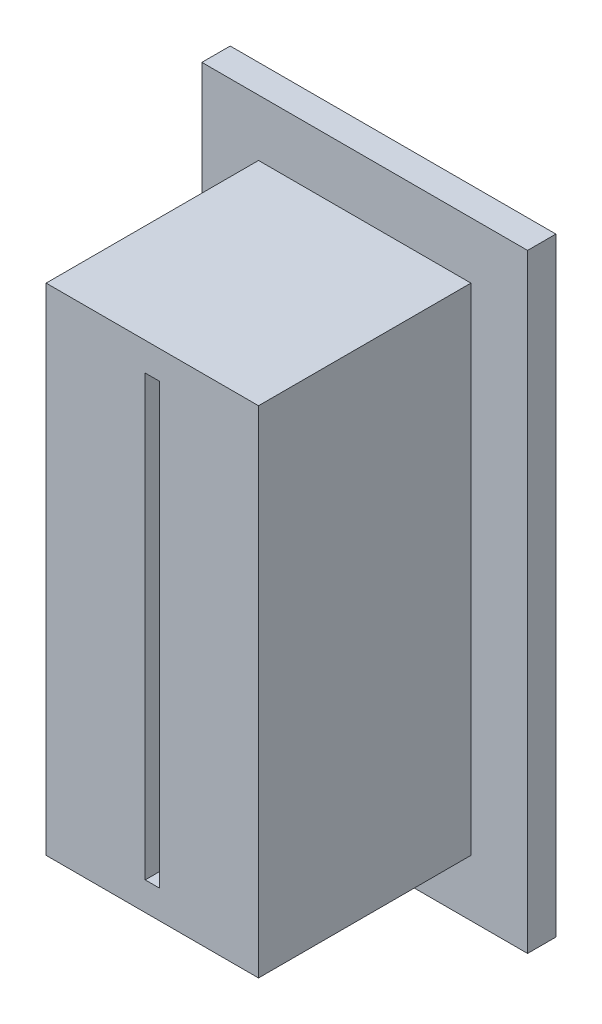
ISO-10303-21;
HEADER;
FILE_DESCRIPTION(('STEP AP214'),'2;1');
FILE_NAME('part.step','',(''),(''),'','','');
FILE_SCHEMA(('AUTOMOTIVE_DESIGN { 1 0 10303 214 1 1 1 1 }'));
ENDSEC;
DATA;
#1=APPLICATION_CONTEXT('core data for automotive mechanical design processes');
#2=APPLICATION_PROTOCOL_DEFINITION('international standard','automotive_design',2000,#1);
#3=PRODUCT_CONTEXT('',#1,'mechanical');
#4=PRODUCT('Part','Part','',(#3));
#5=PRODUCT_RELATED_PRODUCT_CATEGORY('part','',(#4));
#6=PRODUCT_DEFINITION_FORMATION('','',#4);
#7=PRODUCT_DEFINITION_CONTEXT('part definition',#1,'design');
#8=PRODUCT_DEFINITION('design','',#6,#7);
#9=PRODUCT_DEFINITION_SHAPE('','',#8);
#10=(LENGTH_UNIT() NAMED_UNIT(*) SI_UNIT(.MILLI.,.METRE.));
#11=(NAMED_UNIT(*) PLANE_ANGLE_UNIT() SI_UNIT($,.RADIAN.));
#12=(NAMED_UNIT(*) SI_UNIT($,.STERADIAN.) SOLID_ANGLE_UNIT());
#13=UNCERTAINTY_MEASURE_WITH_UNIT(LENGTH_MEASURE(1.E-05),#10,'distance_accuracy_value','');
#14=(GEOMETRIC_REPRESENTATION_CONTEXT(3) GLOBAL_UNCERTAINTY_ASSIGNED_CONTEXT((#13)) GLOBAL_UNIT_ASSIGNED_CONTEXT((#10,
#11,#12)) REPRESENTATION_CONTEXT('',''));
#15=CARTESIAN_POINT('',(0.,0.,0.));
#16=DIRECTION('',(0.,0.,1.));
#17=DIRECTION('',(1.,0.,0.));
#18=AXIS2_PLACEMENT_3D('',#15,#16,#17);
#19=CARTESIAN_POINT('',(0.,0.,13.5));
#20=DIRECTION('',(0.,0.,1.));
#21=DIRECTION('',(1.,0.,0.));
#22=AXIS2_PLACEMENT_3D('',#19,#20,#21);
#23=PLANE('',#22);
#24=DIRECTION('',(1.,0.,0.));
#25=VECTOR('',#24,1.);
#26=CARTESIAN_POINT('',(0.,-15.5,13.5));
#27=LINE('',#26,#25);
#28=CARTESIAN_POINT('',(-0.5,-15.5,13.5));
#29=VERTEX_POINT('',#28);
#30=CARTESIAN_POINT('',(0.5,-15.5,13.5));
#31=VERTEX_POINT('',#30);
#32=EDGE_CURVE('E185',#29,#31,#27,.T.);
#33=ORIENTED_EDGE('',*,*,#32,.T.);
#34=DIRECTION('',(0.,1.,0.));
#35=VECTOR('',#34,1.);
#36=CARTESIAN_POINT('',(0.5,0.,13.5));
#37=LINE('',#36,#35);
#38=CARTESIAN_POINT('',(0.5,15.5,13.5));
#39=VERTEX_POINT('',#38);
#40=EDGE_CURVE('E188',#31,#39,#37,.T.);
#41=ORIENTED_EDGE('',*,*,#40,.T.);
#42=DIRECTION('',(-1.,0.,0.));
#43=VECTOR('',#42,1.);
#44=CARTESIAN_POINT('',(0.,15.5,13.5));
#45=LINE('',#44,#43);
#46=CARTESIAN_POINT('',(-0.5,15.5,13.5));
#47=VERTEX_POINT('',#46);
#48=EDGE_CURVE('E180',#39,#47,#45,.T.);
#49=ORIENTED_EDGE('',*,*,#48,.T.);
#50=DIRECTION('',(0.,-1.,0.));
#51=VECTOR('',#50,1.);
#52=CARTESIAN_POINT('',(-0.5,0.,13.5));
#53=LINE('',#52,#51);
#54=EDGE_CURVE('E160',#47,#29,#53,.T.);
#55=ORIENTED_EDGE('',*,*,#54,.T.);
#56=EDGE_LOOP('',(#33,#41,#49,#55));
#57=FACE_BOUND('',#56,.T.);
#58=DIRECTION('',(-1.,0.,0.));
#59=VECTOR('',#58,1.);
#60=CARTESIAN_POINT('',(6.,-16.,13.5));
#61=LINE('',#60,#59);
#62=CARTESIAN_POINT('',(6.,-16.,13.5));
#63=VERTEX_POINT('',#62);
#64=CARTESIAN_POINT('',(-6.,-16.,13.5));
#65=VERTEX_POINT('',#64);
#66=EDGE_CURVE('E237',#63,#65,#61,.T.);
#67=ORIENTED_EDGE('',*,*,#66,.T.);
#68=DIRECTION('',(0.,1.,0.));
#69=VECTOR('',#68,1.);
#70=CARTESIAN_POINT('',(-6.,-16.,13.5));
#71=LINE('',#70,#69);
#72=CARTESIAN_POINT('',(-6.,16.,13.5));
#73=VERTEX_POINT('',#72);
#74=EDGE_CURVE('E233',#65,#73,#71,.T.);
#75=ORIENTED_EDGE('',*,*,#74,.T.);
#76=DIRECTION('',(1.,0.,0.));
#77=VECTOR('',#76,1.);
#78=CARTESIAN_POINT('',(-6.,16.,13.5));
#79=LINE('',#78,#77);
#80=CARTESIAN_POINT('',(6.,16.,13.5));
#81=VERTEX_POINT('',#80);
#82=EDGE_CURVE('E246',#73,#81,#79,.T.);
#83=ORIENTED_EDGE('',*,*,#82,.T.);
#84=DIRECTION('',(0.,-1.,0.));
#85=VECTOR('',#84,1.);
#86=CARTESIAN_POINT('',(6.,16.,13.5));
#87=LINE('',#86,#85);
#88=EDGE_CURVE('E242',#81,#63,#87,.T.);
#89=ORIENTED_EDGE('',*,*,#88,.T.);
#90=EDGE_LOOP('',(#67,#75,#83,#89));
#91=FACE_BOUND('',#90,.T.);
#92=ADVANCED_FACE('F41',(#57,#91),#23,.F.);
#93=CARTESIAN_POINT('',(-6.,-16.,49.1760149812701));
#94=DIRECTION('',(-1.,0.,0.));
#95=DIRECTION('',(0.,-1.,0.));
#96=AXIS2_PLACEMENT_3D('',#93,#94,#95);
#97=PLANE('',#96);
#98=DIRECTION('',(0.,0.,-1.));
#99=VECTOR('',#98,1.);
#100=CARTESIAN_POINT('',(-6.,-16.,49.1760149812701));
#101=LINE('',#100,#99);
#102=CARTESIAN_POINT('',(-6.,-16.,-2.));
#103=VERTEX_POINT('',#102);
#104=EDGE_CURVE('E240',#65,#103,#101,.T.);
#105=ORIENTED_EDGE('',*,*,#104,.T.);
#106=DIRECTION('',(0.,1.,0.));
#107=VECTOR('',#106,1.);
#108=CARTESIAN_POINT('',(-6.,-16.,-2.));
#109=LINE('',#108,#107);
#110=CARTESIAN_POINT('',(-6.,16.,-2.));
#111=VERTEX_POINT('',#110);
#112=EDGE_CURVE('E197',#103,#111,#109,.T.);
#113=ORIENTED_EDGE('',*,*,#112,.T.);
#114=DIRECTION('',(0.,0.,-1.));
#115=VECTOR('',#114,1.);
#116=CARTESIAN_POINT('',(-6.,16.,49.1760149812701));
#117=LINE('',#116,#115);
#118=EDGE_CURVE('E236',#73,#111,#117,.T.);
#119=ORIENTED_EDGE('',*,*,#118,.F.);
#120=ORIENTED_EDGE('',*,*,#74,.F.);
#121=EDGE_LOOP('',(#105,#113,#119,#120));
#122=FACE_BOUND('',#121,.T.);
#123=ADVANCED_FACE('F311',(#122),#97,.F.);
#124=CARTESIAN_POINT('',(-6.,16.,49.1760149812701));
#125=DIRECTION('',(0.,1.,0.));
#126=DIRECTION('',(0.,0.,1.));
#127=AXIS2_PLACEMENT_3D('',#124,#125,#126);
#128=PLANE('',#127);
#129=ORIENTED_EDGE('',*,*,#118,.T.);
#130=DIRECTION('',(1.,0.,0.));
#131=VECTOR('',#130,1.);
#132=CARTESIAN_POINT('',(-6.,16.,-2.));
#133=LINE('',#132,#131);
#134=CARTESIAN_POINT('',(6.,16.,-2.));
#135=VERTEX_POINT('',#134);
#136=EDGE_CURVE('E200',#111,#135,#133,.T.);
#137=ORIENTED_EDGE('',*,*,#136,.T.);
#138=DIRECTION('',(0.,0.,-1.));
#139=VECTOR('',#138,1.);
#140=CARTESIAN_POINT('',(6.,16.,49.1760149812701));
#141=LINE('',#140,#139);
#142=EDGE_CURVE('E245',#81,#135,#141,.T.);
#143=ORIENTED_EDGE('',*,*,#142,.F.);
#144=ORIENTED_EDGE('',*,*,#82,.F.);
#145=EDGE_LOOP('',(#129,#137,#143,#144));
#146=FACE_BOUND('',#145,.T.);
#147=ADVANCED_FACE('F317',(#146),#128,.F.);
#148=CARTESIAN_POINT('',(6.,16.,49.1760149812701));
#149=DIRECTION('',(1.,0.,0.));
#150=DIRECTION('',(0.,0.,-1.));
#151=AXIS2_PLACEMENT_3D('',#148,#149,#150);
#152=PLANE('',#151);
#153=ORIENTED_EDGE('',*,*,#142,.T.);
#154=DIRECTION('',(0.,-1.,0.));
#155=VECTOR('',#154,1.);
#156=CARTESIAN_POINT('',(6.,16.,-2.));
#157=LINE('',#156,#155);
#158=CARTESIAN_POINT('',(6.,-16.,-2.));
#159=VERTEX_POINT('',#158);
#160=EDGE_CURVE('E191',#135,#159,#157,.T.);
#161=ORIENTED_EDGE('',*,*,#160,.T.);
#162=DIRECTION('',(0.,0.,-1.));
#163=VECTOR('',#162,1.);
#164=CARTESIAN_POINT('',(6.,-16.,49.1760149812701));
#165=LINE('',#164,#163);
#166=EDGE_CURVE('E241',#63,#159,#165,.T.);
#167=ORIENTED_EDGE('',*,*,#166,.F.);
#168=ORIENTED_EDGE('',*,*,#88,.F.);
#169=EDGE_LOOP('',(#153,#161,#167,#168));
#170=FACE_BOUND('',#169,.T.);
#171=ADVANCED_FACE('F324',(#170),#152,.F.);
#172=CARTESIAN_POINT('',(6.,-16.,49.1760149812701));
#173=DIRECTION('',(0.,-1.,0.));
#174=DIRECTION('',(0.,0.,-1.));
#175=AXIS2_PLACEMENT_3D('',#172,#173,#174);
#176=PLANE('',#175);
#177=ORIENTED_EDGE('',*,*,#166,.T.);
#178=DIRECTION('',(-1.,0.,0.));
#179=VECTOR('',#178,1.);
#180=CARTESIAN_POINT('',(6.,-16.,-2.));
#181=LINE('',#180,#179);
#182=EDGE_CURVE('E194',#159,#103,#181,.T.);
#183=ORIENTED_EDGE('',*,*,#182,.T.);
#184=ORIENTED_EDGE('',*,*,#104,.F.);
#185=ORIENTED_EDGE('',*,*,#66,.F.);
#186=EDGE_LOOP('',(#177,#183,#184,#185));
#187=FACE_BOUND('',#186,.T.);
#188=ADVANCED_FACE('F328',(#187),#176,.F.);
#189=CARTESIAN_POINT('',(0.,0.,-2.));
#190=DIRECTION('',(0.,0.,-1.));
#191=DIRECTION('',(-1.,0.,0.));
#192=AXIS2_PLACEMENT_3D('',#189,#190,#191);
#193=PLANE('',#192);
#194=DIRECTION('',(0.,1.,0.));
#195=VECTOR('',#194,1.);
#196=CARTESIAN_POINT('',(-11.5,-21.5,-2.));
#197=LINE('',#196,#195);
#198=CARTESIAN_POINT('',(-11.5,-21.5,-2.));
#199=VERTEX_POINT('',#198);
#200=CARTESIAN_POINT('',(-11.5,21.5,-2.));
#201=VERTEX_POINT('',#200);
#202=EDGE_CURVE('E204',#199,#201,#197,.T.);
#203=ORIENTED_EDGE('',*,*,#202,.T.);
#204=DIRECTION('',(1.,0.,0.));
#205=VECTOR('',#204,1.);
#206=CARTESIAN_POINT('',(-11.5,21.5,-2.));
#207=LINE('',#206,#205);
#208=CARTESIAN_POINT('',(11.5,21.5,-2.));
#209=VERTEX_POINT('',#208);
#210=EDGE_CURVE('E207',#201,#209,#207,.T.);
#211=ORIENTED_EDGE('',*,*,#210,.T.);
#212=DIRECTION('',(0.,-1.,0.));
#213=VECTOR('',#212,1.);
#214=CARTESIAN_POINT('',(11.5,21.5,-2.));
#215=LINE('',#214,#213);
#216=CARTESIAN_POINT('',(11.5,-21.5,-2.));
#217=VERTEX_POINT('',#216);
#218=EDGE_CURVE('E210',#209,#217,#215,.T.);
#219=ORIENTED_EDGE('',*,*,#218,.T.);
#220=DIRECTION('',(-1.,0.,0.));
#221=VECTOR('',#220,1.);
#222=CARTESIAN_POINT('',(11.5,-21.5,-2.));
#223=LINE('',#222,#221);
#224=EDGE_CURVE('E212',#217,#199,#223,.T.);
#225=ORIENTED_EDGE('',*,*,#224,.T.);
#226=EDGE_LOOP('',(#203,#211,#219,#225));
#227=FACE_BOUND('',#226,.T.);
#228=ORIENTED_EDGE('',*,*,#182,.F.);
#229=ORIENTED_EDGE('',*,*,#160,.F.);
#230=ORIENTED_EDGE('',*,*,#136,.F.);
#231=ORIENTED_EDGE('',*,*,#112,.F.);
#232=EDGE_LOOP('',(#228,#229,#230,#231));
#233=FACE_BOUND('',#232,.T.);
#234=ADVANCED_FACE('F332',(#227,#233),#193,.T.);
#235=CARTESIAN_POINT('',(0.,0.,0.));
#236=DIRECTION('',(0.,0.,-1.));
#237=DIRECTION('',(-1.,0.,0.));
#238=AXIS2_PLACEMENT_3D('',#235,#236,#237);
#239=PLANE('',#238);
#240=DIRECTION('',(0.,-1.,0.));
#241=VECTOR('',#240,1.);
#242=CARTESIAN_POINT('',(-7.5,17.5,0.));
#243=LINE('',#242,#241);
#244=CARTESIAN_POINT('',(-7.5,17.5,0.));
#245=VERTEX_POINT('',#244);
#246=CARTESIAN_POINT('',(-7.5,-17.5,0.));
#247=VERTEX_POINT('',#246);
#248=EDGE_CURVE('E253',#245,#247,#243,.T.);
#249=ORIENTED_EDGE('',*,*,#248,.F.);
#250=DIRECTION('',(-1.,0.,0.));
#251=VECTOR('',#250,1.);
#252=CARTESIAN_POINT('',(-7.5,17.5,0.));
#253=LINE('',#252,#251);
#254=CARTESIAN_POINT('',(7.5,17.5,0.));
#255=VERTEX_POINT('',#254);
#256=EDGE_CURVE('E258',#255,#245,#253,.T.);
#257=ORIENTED_EDGE('',*,*,#256,.F.);
#258=DIRECTION('',(0.,1.,0.));
#259=VECTOR('',#258,1.);
#260=CARTESIAN_POINT('',(7.5,17.5,0.));
#261=LINE('',#260,#259);
#262=CARTESIAN_POINT('',(7.5,-17.5,0.));
#263=VERTEX_POINT('',#262);
#264=EDGE_CURVE('E270',#263,#255,#261,.T.);
#265=ORIENTED_EDGE('',*,*,#264,.F.);
#266=DIRECTION('',(1.,0.,0.));
#267=VECTOR('',#266,1.);
#268=CARTESIAN_POINT('',(-7.5,-17.5,0.));
#269=LINE('',#268,#267);
#270=EDGE_CURVE('E267',#247,#263,#269,.T.);
#271=ORIENTED_EDGE('',*,*,#270,.F.);
#272=EDGE_LOOP('',(#249,#257,#265,#271));
#273=FACE_BOUND('',#272,.T.);
#274=DIRECTION('',(0.,1.,0.));
#275=VECTOR('',#274,1.);
#276=CARTESIAN_POINT('',(-11.5,-21.5,0.));
#277=LINE('',#276,#275);
#278=CARTESIAN_POINT('',(-11.5,-21.5,0.));
#279=VERTEX_POINT('',#278);
#280=CARTESIAN_POINT('',(-11.5,21.5,0.));
#281=VERTEX_POINT('',#280);
#282=EDGE_CURVE('E203',#279,#281,#277,.T.);
#283=ORIENTED_EDGE('',*,*,#282,.F.);
#284=DIRECTION('',(-1.,0.,0.));
#285=VECTOR('',#284,1.);
#286=CARTESIAN_POINT('',(11.5,-21.5,0.));
#287=LINE('',#286,#285);
#288=CARTESIAN_POINT('',(11.5,-21.5,0.));
#289=VERTEX_POINT('',#288);
#290=EDGE_CURVE('E208',#289,#279,#287,.T.);
#291=ORIENTED_EDGE('',*,*,#290,.F.);
#292=DIRECTION('',(0.,-1.,0.));
#293=VECTOR('',#292,1.);
#294=CARTESIAN_POINT('',(11.5,21.5,0.));
#295=LINE('',#294,#293);
#296=CARTESIAN_POINT('',(11.5,21.5,0.));
#297=VERTEX_POINT('',#296);
#298=EDGE_CURVE('E219',#297,#289,#295,.T.);
#299=ORIENTED_EDGE('',*,*,#298,.F.);
#300=DIRECTION('',(1.,0.,0.));
#301=VECTOR('',#300,1.);
#302=CARTESIAN_POINT('',(-11.5,21.5,0.));
#303=LINE('',#302,#301);
#304=EDGE_CURVE('E217',#281,#297,#303,.T.);
#305=ORIENTED_EDGE('',*,*,#304,.F.);
#306=EDGE_LOOP('',(#283,#291,#299,#305));
#307=FACE_BOUND('',#306,.T.);
#308=ADVANCED_FACE('F289',(#273,#307),#239,.F.);
#309=CARTESIAN_POINT('',(-11.5,-21.5,-2.));
#310=DIRECTION('',(1.,0.,0.));
#311=DIRECTION('',(0.,1.,0.));
#312=AXIS2_PLACEMENT_3D('',#309,#310,#311);
#313=PLANE('',#312);
#314=ORIENTED_EDGE('',*,*,#282,.T.);
#315=DIRECTION('',(0.,0.,1.));
#316=VECTOR('',#315,1.);
#317=CARTESIAN_POINT('',(-11.5,21.5,-2.));
#318=LINE('',#317,#316);
#319=EDGE_CURVE('E230',#201,#281,#318,.T.);
#320=ORIENTED_EDGE('',*,*,#319,.F.);
#321=ORIENTED_EDGE('',*,*,#202,.F.);
#322=DIRECTION('',(0.,0.,1.));
#323=VECTOR('',#322,1.);
#324=CARTESIAN_POINT('',(-11.5,-21.5,-2.));
#325=LINE('',#324,#323);
#326=EDGE_CURVE('E214',#199,#279,#325,.T.);
#327=ORIENTED_EDGE('',*,*,#326,.T.);
#328=EDGE_LOOP('',(#314,#320,#321,#327));
#329=FACE_BOUND('',#328,.T.);
#330=ADVANCED_FACE('F334',(#329),#313,.F.);
#331=CARTESIAN_POINT('',(-11.5,21.5,-2.));
#332=DIRECTION('',(0.,-1.,0.));
#333=DIRECTION('',(0.,0.,-1.));
#334=AXIS2_PLACEMENT_3D('',#331,#332,#333);
#335=PLANE('',#334);
#336=ORIENTED_EDGE('',*,*,#304,.T.);
#337=DIRECTION('',(0.,0.,1.));
#338=VECTOR('',#337,1.);
#339=CARTESIAN_POINT('',(11.5,21.5,-2.));
#340=LINE('',#339,#338);
#341=EDGE_CURVE('E227',#209,#297,#340,.T.);
#342=ORIENTED_EDGE('',*,*,#341,.F.);
#343=ORIENTED_EDGE('',*,*,#210,.F.);
#344=ORIENTED_EDGE('',*,*,#319,.T.);
#345=EDGE_LOOP('',(#336,#342,#343,#344));
#346=FACE_BOUND('',#345,.T.);
#347=ADVANCED_FACE('F337',(#346),#335,.F.);
#348=CARTESIAN_POINT('',(11.5,21.5,-2.));
#349=DIRECTION('',(-1.,0.,0.));
#350=DIRECTION('',(0.,0.,1.));
#351=AXIS2_PLACEMENT_3D('',#348,#349,#350);
#352=PLANE('',#351);
#353=ORIENTED_EDGE('',*,*,#298,.T.);
#354=DIRECTION('',(0.,0.,1.));
#355=VECTOR('',#354,1.);
#356=CARTESIAN_POINT('',(11.5,-21.5,-2.));
#357=LINE('',#356,#355);
#358=EDGE_CURVE('E224',#217,#289,#357,.T.);
#359=ORIENTED_EDGE('',*,*,#358,.F.);
#360=ORIENTED_EDGE('',*,*,#218,.F.);
#361=ORIENTED_EDGE('',*,*,#341,.T.);
#362=EDGE_LOOP('',(#353,#359,#360,#361));
#363=FACE_BOUND('',#362,.T.);
#364=ADVANCED_FACE('F306',(#363),#352,.F.);
#365=CARTESIAN_POINT('',(11.5,-21.5,-2.));
#366=DIRECTION('',(0.,1.,0.));
#367=DIRECTION('',(0.,0.,1.));
#368=AXIS2_PLACEMENT_3D('',#365,#366,#367);
#369=PLANE('',#368);
#370=ORIENTED_EDGE('',*,*,#290,.T.);
#371=ORIENTED_EDGE('',*,*,#326,.F.);
#372=ORIENTED_EDGE('',*,*,#224,.F.);
#373=ORIENTED_EDGE('',*,*,#358,.T.);
#374=EDGE_LOOP('',(#370,#371,#372,#373));
#375=FACE_BOUND('',#374,.T.);
#376=ADVANCED_FACE('F298',(#375),#369,.F.);
#377=CARTESIAN_POINT('',(0.,0.,15.));
#378=DIRECTION('',(0.,0.,1.));
#379=DIRECTION('',(1.,0.,0.));
#380=AXIS2_PLACEMENT_3D('',#377,#378,#379);
#381=PLANE('',#380);
#382=DIRECTION('',(0.,1.,0.));
#383=VECTOR('',#382,1.);
#384=CARTESIAN_POINT('',(0.5,-15.5,15.));
#385=LINE('',#384,#383);
#386=CARTESIAN_POINT('',(0.5,-15.5,15.));
#387=VERTEX_POINT('',#386);
#388=CARTESIAN_POINT('',(0.5,15.5,15.));
#389=VERTEX_POINT('',#388);
#390=EDGE_CURVE('E64',#387,#389,#385,.T.);
#391=ORIENTED_EDGE('',*,*,#390,.F.);
#392=DIRECTION('',(1.,0.,0.));
#393=VECTOR('',#392,1.);
#394=CARTESIAN_POINT('',(0.5,-15.5,15.));
#395=LINE('',#394,#393);
#396=CARTESIAN_POINT('',(-0.5,-15.5,15.));
#397=VERTEX_POINT('',#396);
#398=EDGE_CURVE('E173',#397,#387,#395,.T.);
#399=ORIENTED_EDGE('',*,*,#398,.F.);
#400=DIRECTION('',(0.,-1.,0.));
#401=VECTOR('',#400,1.);
#402=CARTESIAN_POINT('',(-0.5,-15.5,15.));
#403=LINE('',#402,#401);
#404=CARTESIAN_POINT('',(-0.5,15.5,15.));
#405=VERTEX_POINT('',#404);
#406=EDGE_CURVE('E157',#405,#397,#403,.T.);
#407=ORIENTED_EDGE('',*,*,#406,.F.);
#408=DIRECTION('',(-1.,0.,0.));
#409=VECTOR('',#408,1.);
#410=CARTESIAN_POINT('',(0.5,15.5,15.));
#411=LINE('',#410,#409);
#412=EDGE_CURVE('E166',#389,#405,#411,.T.);
#413=ORIENTED_EDGE('',*,*,#412,.F.);
#414=EDGE_LOOP('',(#391,#399,#407,#413));
#415=FACE_BOUND('',#414,.T.);
#416=DIRECTION('',(0.,-1.,0.));
#417=VECTOR('',#416,1.);
#418=CARTESIAN_POINT('',(-7.5,17.5,15.));
#419=LINE('',#418,#417);
#420=CARTESIAN_POINT('',(-7.5,17.5,15.));
#421=VERTEX_POINT('',#420);
#422=CARTESIAN_POINT('',(-7.5,-17.5,15.));
#423=VERTEX_POINT('',#422);
#424=EDGE_CURVE('E254',#421,#423,#419,.T.);
#425=ORIENTED_EDGE('',*,*,#424,.T.);
#426=DIRECTION('',(1.,0.,0.));
#427=VECTOR('',#426,1.);
#428=CARTESIAN_POINT('',(-7.5,-17.5,15.));
#429=LINE('',#428,#427);
#430=CARTESIAN_POINT('',(7.5,-17.5,15.));
#431=VERTEX_POINT('',#430);
#432=EDGE_CURVE('E257',#423,#431,#429,.T.);
#433=ORIENTED_EDGE('',*,*,#432,.T.);
#434=DIRECTION('',(0.,1.,0.));
#435=VECTOR('',#434,1.);
#436=CARTESIAN_POINT('',(7.5,17.5,15.));
#437=LINE('',#436,#435);
#438=CARTESIAN_POINT('',(7.5,17.5,15.));
#439=VERTEX_POINT('',#438);
#440=EDGE_CURVE('E260',#431,#439,#437,.T.);
#441=ORIENTED_EDGE('',*,*,#440,.T.);
#442=DIRECTION('',(-1.,0.,0.));
#443=VECTOR('',#442,1.);
#444=CARTESIAN_POINT('',(-7.5,17.5,15.));
#445=LINE('',#444,#443);
#446=EDGE_CURVE('E262',#439,#421,#445,.T.);
#447=ORIENTED_EDGE('',*,*,#446,.T.);
#448=EDGE_LOOP('',(#425,#433,#441,#447));
#449=FACE_BOUND('',#448,.T.);
#450=ADVANCED_FACE('F170',(#415,#449),#381,.T.);
#451=CARTESIAN_POINT('',(-7.5,-17.5,15.));
#452=DIRECTION('',(0.,1.,0.));
#453=DIRECTION('',(0.,0.,1.));
#454=AXIS2_PLACEMENT_3D('',#451,#452,#453);
#455=PLANE('',#454);
#456=ORIENTED_EDGE('',*,*,#270,.T.);
#457=DIRECTION('',(0.,0.,-1.));
#458=VECTOR('',#457,1.);
#459=CARTESIAN_POINT('',(7.5,-17.5,15.));
#460=LINE('',#459,#458);
#461=EDGE_CURVE('E49',#431,#263,#460,.T.);
#462=ORIENTED_EDGE('',*,*,#461,.F.);
#463=ORIENTED_EDGE('',*,*,#432,.F.);
#464=DIRECTION('',(0.,0.,-1.));
#465=VECTOR('',#464,1.);
#466=CARTESIAN_POINT('',(-7.5,-17.5,15.));
#467=LINE('',#466,#465);
#468=EDGE_CURVE('E12',#423,#247,#467,.T.);
#469=ORIENTED_EDGE('',*,*,#468,.T.);
#470=EDGE_LOOP('',(#456,#462,#463,#469));
#471=FACE_BOUND('',#470,.T.);
#472=ADVANCED_FACE('F286',(#471),#455,.F.);
#473=CARTESIAN_POINT('',(7.5,17.5,15.));
#474=DIRECTION('',(-1.,0.,0.));
#475=DIRECTION('',(0.,0.,1.));
#476=AXIS2_PLACEMENT_3D('',#473,#474,#475);
#477=PLANE('',#476);
#478=ORIENTED_EDGE('',*,*,#264,.T.);
#479=DIRECTION('',(0.,0.,-1.));
#480=VECTOR('',#479,1.);
#481=CARTESIAN_POINT('',(7.5,17.5,15.));
#482=LINE('',#481,#480);
#483=EDGE_CURVE('E277',#439,#255,#482,.T.);
#484=ORIENTED_EDGE('',*,*,#483,.F.);
#485=ORIENTED_EDGE('',*,*,#440,.F.);
#486=ORIENTED_EDGE('',*,*,#461,.T.);
#487=EDGE_LOOP('',(#478,#484,#485,#486));
#488=FACE_BOUND('',#487,.T.);
#489=ADVANCED_FACE('F283',(#488),#477,.F.);
#490=CARTESIAN_POINT('',(-7.5,17.5,15.));
#491=DIRECTION('',(0.,-1.,0.));
#492=DIRECTION('',(0.,0.,-1.));
#493=AXIS2_PLACEMENT_3D('',#490,#491,#492);
#494=PLANE('',#493);
#495=ORIENTED_EDGE('',*,*,#256,.T.);
#496=DIRECTION('',(0.,0.,-1.));
#497=VECTOR('',#496,1.);
#498=CARTESIAN_POINT('',(-7.5,17.5,15.));
#499=LINE('',#498,#497);
#500=EDGE_CURVE('E264',#421,#245,#499,.T.);
#501=ORIENTED_EDGE('',*,*,#500,.F.);
#502=ORIENTED_EDGE('',*,*,#446,.F.);
#503=ORIENTED_EDGE('',*,*,#483,.T.);
#504=EDGE_LOOP('',(#495,#501,#502,#503));
#505=FACE_BOUND('',#504,.T.);
#506=ADVANCED_FACE('F293',(#505),#494,.F.);
#507=CARTESIAN_POINT('',(-7.5,17.5,15.));
#508=DIRECTION('',(1.,0.,0.));
#509=DIRECTION('',(0.,1.,0.));
#510=AXIS2_PLACEMENT_3D('',#507,#508,#509);
#511=PLANE('',#510);
#512=ORIENTED_EDGE('',*,*,#248,.T.);
#513=ORIENTED_EDGE('',*,*,#468,.F.);
#514=ORIENTED_EDGE('',*,*,#424,.F.);
#515=ORIENTED_EDGE('',*,*,#500,.T.);
#516=EDGE_LOOP('',(#512,#513,#514,#515));
#517=FACE_BOUND('',#516,.T.);
#518=ADVANCED_FACE('F43',(#517),#511,.F.);
#519=CARTESIAN_POINT('',(0.5,-15.5,13.));
#520=DIRECTION('',(1.,0.,0.));
#521=DIRECTION('',(0.,0.,-1.));
#522=AXIS2_PLACEMENT_3D('',#519,#520,#521);
#523=PLANE('',#522);
#524=DIRECTION('',(0.,0.,1.));
#525=VECTOR('',#524,1.);
#526=CARTESIAN_POINT('',(0.5,-15.5,13.));
#527=LINE('',#526,#525);
#528=EDGE_CURVE('E178',#31,#387,#527,.T.);
#529=ORIENTED_EDGE('',*,*,#528,.T.);
#530=ORIENTED_EDGE('',*,*,#390,.T.);
#531=DIRECTION('',(0.,0.,1.));
#532=VECTOR('',#531,1.);
#533=CARTESIAN_POINT('',(0.5,15.5,13.));
#534=LINE('',#533,#532);
#535=EDGE_CURVE('E163',#39,#389,#534,.T.);
#536=ORIENTED_EDGE('',*,*,#535,.F.);
#537=ORIENTED_EDGE('',*,*,#40,.F.);
#538=EDGE_LOOP('',(#529,#530,#536,#537));
#539=FACE_BOUND('',#538,.T.);
#540=ADVANCED_FACE('F350',(#539),#523,.F.);
#541=CARTESIAN_POINT('',(0.5,-15.5,13.));
#542=DIRECTION('',(0.,-1.,0.));
#543=DIRECTION('',(0.,0.,-1.));
#544=AXIS2_PLACEMENT_3D('',#541,#542,#543);
#545=PLANE('',#544);
#546=DIRECTION('',(0.,0.,1.));
#547=VECTOR('',#546,1.);
#548=CARTESIAN_POINT('',(-0.5,-15.5,13.));
#549=LINE('',#548,#547);
#550=EDGE_CURVE('E162',#29,#397,#549,.T.);
#551=ORIENTED_EDGE('',*,*,#550,.T.);
#552=ORIENTED_EDGE('',*,*,#398,.T.);
#553=ORIENTED_EDGE('',*,*,#528,.F.);
#554=ORIENTED_EDGE('',*,*,#32,.F.);
#555=EDGE_LOOP('',(#551,#552,#553,#554));
#556=FACE_BOUND('',#555,.T.);
#557=ADVANCED_FACE('F352',(#556),#545,.F.);
#558=CARTESIAN_POINT('',(-0.5,-15.5,13.));
#559=DIRECTION('',(-1.,0.,0.));
#560=DIRECTION('',(0.,0.,1.));
#561=AXIS2_PLACEMENT_3D('',#558,#559,#560);
#562=PLANE('',#561);
#563=DIRECTION('',(0.,0.,1.));
#564=VECTOR('',#563,1.);
#565=CARTESIAN_POINT('',(-0.5,15.5,13.));
#566=LINE('',#565,#564);
#567=EDGE_CURVE('E56',#47,#405,#566,.T.);
#568=ORIENTED_EDGE('',*,*,#567,.T.);
#569=ORIENTED_EDGE('',*,*,#406,.T.);
#570=ORIENTED_EDGE('',*,*,#550,.F.);
#571=ORIENTED_EDGE('',*,*,#54,.F.);
#572=EDGE_LOOP('',(#568,#569,#570,#571));
#573=FACE_BOUND('',#572,.T.);
#574=ADVANCED_FACE('F154',(#573),#562,.F.);
#575=CARTESIAN_POINT('',(0.5,15.5,13.));
#576=DIRECTION('',(0.,1.,0.));
#577=DIRECTION('',(0.,0.,1.));
#578=AXIS2_PLACEMENT_3D('',#575,#576,#577);
#579=PLANE('',#578);
#580=ORIENTED_EDGE('',*,*,#535,.T.);
#581=ORIENTED_EDGE('',*,*,#412,.T.);
#582=ORIENTED_EDGE('',*,*,#567,.F.);
#583=ORIENTED_EDGE('',*,*,#48,.F.);
#584=EDGE_LOOP('',(#580,#581,#582,#583));
#585=FACE_BOUND('',#584,.T.);
#586=ADVANCED_FACE('F167',(#585),#579,.F.);
#587=CLOSED_SHELL('',(#92,#123,#147,#171,#188,#234,#308,#330,#347,#364,#376,#450,#472,#489,#506,
#518,#540,#557,#574,#586));
#588=MANIFOLD_SOLID_BREP('B2',#587);
#589=ADVANCED_BREP_SHAPE_REPRESENTATION('',(#18,#588),#14);
#590=SHAPE_DEFINITION_REPRESENTATION(#9,#589);
ENDSEC;
END-ISO-10303-21;
